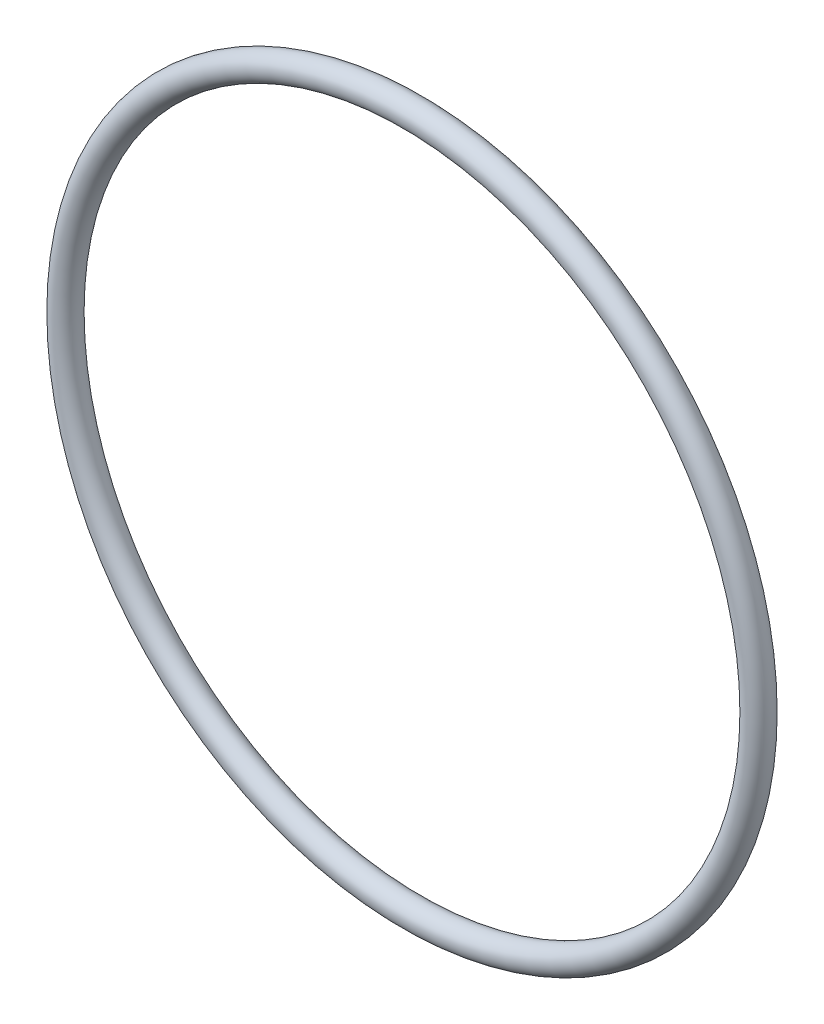
ISO-10303-21;
HEADER;
FILE_DESCRIPTION(('STEP AP214'),'2;1');
FILE_NAME('part.step','',(''),(''),'','','');
FILE_SCHEMA(('AUTOMOTIVE_DESIGN { 1 0 10303 214 1 1 1 1 }'));
ENDSEC;
DATA;
#1=APPLICATION_CONTEXT('core data for automotive mechanical design processes');
#2=APPLICATION_PROTOCOL_DEFINITION('international standard','automotive_design',2000,#1);
#3=PRODUCT_CONTEXT('',#1,'mechanical');
#4=PRODUCT('Part','Part','',(#3));
#5=PRODUCT_RELATED_PRODUCT_CATEGORY('part','',(#4));
#6=PRODUCT_DEFINITION_FORMATION('','',#4);
#7=PRODUCT_DEFINITION_CONTEXT('part definition',#1,'design');
#8=PRODUCT_DEFINITION('design','',#6,#7);
#9=PRODUCT_DEFINITION_SHAPE('','',#8);
#10=(LENGTH_UNIT() NAMED_UNIT(*) SI_UNIT(.MILLI.,.METRE.));
#11=(NAMED_UNIT(*) PLANE_ANGLE_UNIT() SI_UNIT($,.RADIAN.));
#12=(NAMED_UNIT(*) SI_UNIT($,.STERADIAN.) SOLID_ANGLE_UNIT());
#13=UNCERTAINTY_MEASURE_WITH_UNIT(LENGTH_MEASURE(1.E-05),#10,'distance_accuracy_value','');
#14=(GEOMETRIC_REPRESENTATION_CONTEXT(3) GLOBAL_UNCERTAINTY_ASSIGNED_CONTEXT((#13)) GLOBAL_UNIT_ASSIGNED_CONTEXT((#10,
#11,#12)) REPRESENTATION_CONTEXT('',''));
#15=CARTESIAN_POINT('',(0.,0.,0.));
#16=DIRECTION('',(0.,0.,1.));
#17=DIRECTION('',(1.,0.,0.));
#18=AXIS2_PLACEMENT_3D('',#15,#16,#17);
#19=CARTESIAN_POINT('',(0.,0.,0.));
#20=DIRECTION('',(0.,0.,-1.));
#21=DIRECTION('',(-1.,0.,0.));
#22=AXIS2_PLACEMENT_3D('',#19,#20,#21);
#23=TOROIDAL_SURFACE('',#22,34.825,1.325);
#24=CARTESIAN_POINT('',(-36.15,0.,0.));
#25=VERTEX_POINT('',#24);
#26=VERTEX_LOOP('',#25);
#27=FACE_BOUND('',#26,.T.);
#28=ADVANCED_FACE('F28',(#27),#23,.T.);
#29=CLOSED_SHELL('',(#28));
#30=MANIFOLD_SOLID_BREP('B2',#29);
#31=ADVANCED_BREP_SHAPE_REPRESENTATION('',(#18,#30),#14);
#32=SHAPE_DEFINITION_REPRESENTATION(#9,#31);
ENDSEC;
END-ISO-10303-21;
